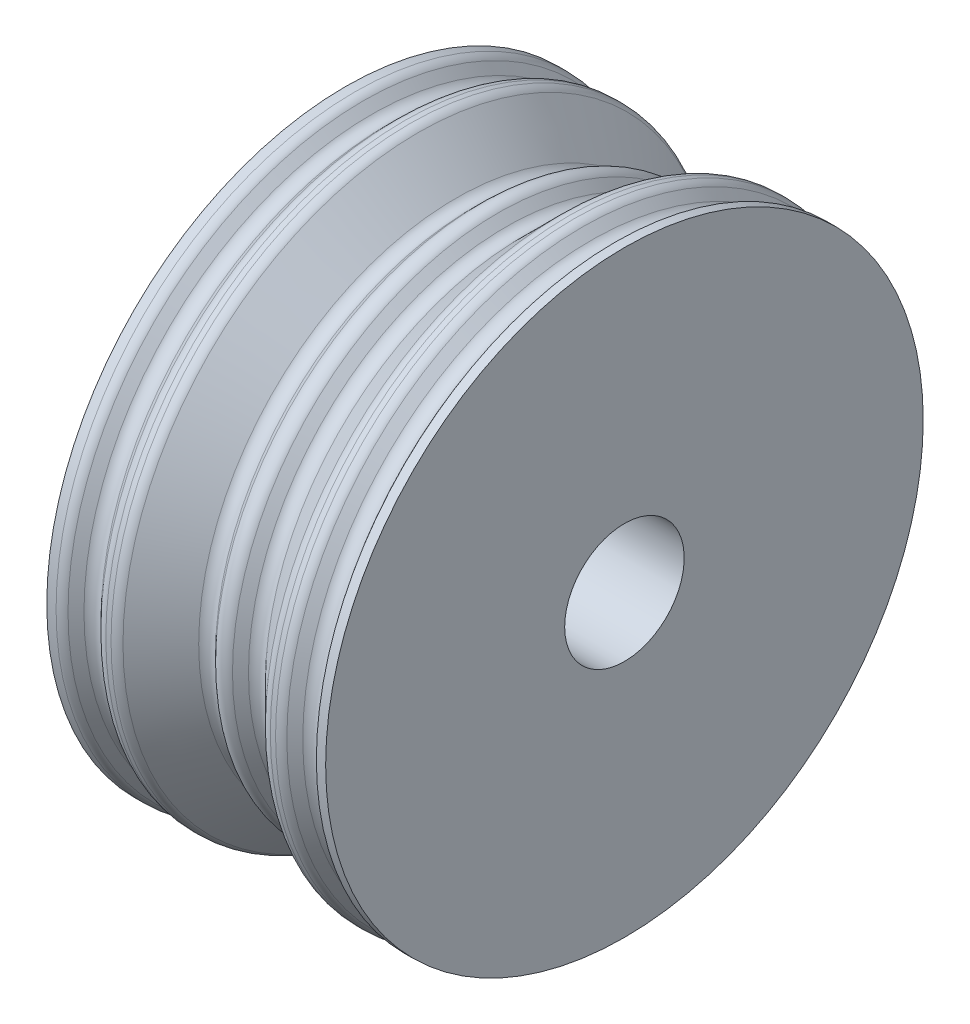
ISO-10303-21;
HEADER;
FILE_DESCRIPTION(('STEP AP214'),'2;1');
FILE_NAME('part.step','',(''),(''),'','','');
FILE_SCHEMA(('AUTOMOTIVE_DESIGN { 1 0 10303 214 1 1 1 1 }'));
ENDSEC;
DATA;
#1=APPLICATION_CONTEXT('core data for automotive mechanical design processes');
#2=APPLICATION_PROTOCOL_DEFINITION('international standard','automotive_design',2000,#1);
#3=PRODUCT_CONTEXT('',#1,'mechanical');
#4=PRODUCT('Part','Part','',(#3));
#5=PRODUCT_RELATED_PRODUCT_CATEGORY('part','',(#4));
#6=PRODUCT_DEFINITION_FORMATION('','',#4);
#7=PRODUCT_DEFINITION_CONTEXT('part definition',#1,'design');
#8=PRODUCT_DEFINITION('design','',#6,#7);
#9=PRODUCT_DEFINITION_SHAPE('','',#8);
#10=(LENGTH_UNIT() NAMED_UNIT(*) SI_UNIT(.MILLI.,.METRE.));
#11=(NAMED_UNIT(*) PLANE_ANGLE_UNIT() SI_UNIT($,.RADIAN.));
#12=(NAMED_UNIT(*) SI_UNIT($,.STERADIAN.) SOLID_ANGLE_UNIT());
#13=UNCERTAINTY_MEASURE_WITH_UNIT(LENGTH_MEASURE(1.E-05),#10,'distance_accuracy_value','');
#14=(GEOMETRIC_REPRESENTATION_CONTEXT(3) GLOBAL_UNCERTAINTY_ASSIGNED_CONTEXT((#13)) GLOBAL_UNIT_ASSIGNED_CONTEXT((#10,
#11,#12)) REPRESENTATION_CONTEXT('',''));
#15=CARTESIAN_POINT('',(0.,0.,0.));
#16=DIRECTION('',(0.,0.,1.));
#17=DIRECTION('',(1.,0.,0.));
#18=AXIS2_PLACEMENT_3D('',#15,#16,#17);
#19=CARTESIAN_POINT('',(0.,0.,0.));
#20=DIRECTION('',(-1.,0.,0.));
#21=DIRECTION('',(0.,0.,1.));
#22=AXIS2_PLACEMENT_3D('',#19,#20,#21);
#23=CYLINDRICAL_SURFACE('',#22,3.81);
#24=CARTESIAN_POINT('',(17.78,0.,0.));
#25=DIRECTION('',(-1.,0.,0.));
#26=DIRECTION('',(0.,0.,1.));
#27=AXIS2_PLACEMENT_3D('',#24,#25,#26);
#28=CIRCLE('',#27,3.81);
#29=CARTESIAN_POINT('',(17.78,0.,3.81));
#30=VERTEX_POINT('',#29);
#31=EDGE_CURVE('E113',#30,#30,#28,.T.);
#32=ORIENTED_EDGE('',*,*,#31,.F.);
#33=EDGE_LOOP('',(#32));
#34=FACE_BOUND('',#33,.T.);
#35=CARTESIAN_POINT('',(0.,0.,0.));
#36=DIRECTION('',(-1.,0.,0.));
#37=DIRECTION('',(0.,0.,1.));
#38=AXIS2_PLACEMENT_3D('',#35,#36,#37);
#39=CIRCLE('',#38,3.81);
#40=CARTESIAN_POINT('',(0.,0.,3.81));
#41=VERTEX_POINT('',#40);
#42=EDGE_CURVE('E10',#41,#41,#39,.T.);
#43=ORIENTED_EDGE('',*,*,#42,.T.);
#44=EDGE_LOOP('',(#43));
#45=FACE_BOUND('',#44,.T.);
#46=ADVANCED_FACE('F34',(#34,#45),#23,.F.);
#47=CARTESIAN_POINT('',(0.,3.81,0.));
#48=DIRECTION('',(1.,0.,0.));
#49=DIRECTION('',(0.,0.,-1.));
#50=AXIS2_PLACEMENT_3D('',#47,#48,#49);
#51=PLANE('',#50);
#52=ORIENTED_EDGE('',*,*,#42,.F.);
#53=EDGE_LOOP('',(#52));
#54=FACE_BOUND('',#53,.T.);
#55=CARTESIAN_POINT('',(0.,0.,0.));
#56=DIRECTION('',(-1.,0.,0.));
#57=DIRECTION('',(0.,0.,1.));
#58=AXIS2_PLACEMENT_3D('',#55,#56,#57);
#59=CIRCLE('',#58,19.05);
#60=CARTESIAN_POINT('',(0.,0.,19.05));
#61=VERTEX_POINT('',#60);
#62=EDGE_CURVE('E40',#61,#61,#59,.T.);
#63=ORIENTED_EDGE('',*,*,#62,.T.);
#64=EDGE_LOOP('',(#63));
#65=FACE_BOUND('',#64,.T.);
#66=ADVANCED_FACE('F120',(#54,#65),#51,.F.);
#67=CARTESIAN_POINT('',(0.,0.,0.));
#68=DIRECTION('',(-1.,0.,0.));
#69=DIRECTION('',(0.,0.,1.));
#70=AXIS2_PLACEMENT_3D('',#67,#68,#69);
#71=CYLINDRICAL_SURFACE('',#70,19.05);
#72=ORIENTED_EDGE('',*,*,#62,.F.);
#73=EDGE_LOOP('',(#72));
#74=FACE_BOUND('',#73,.T.);
#75=CARTESIAN_POINT('',(0.592615410136556,0.,0.));
#76=DIRECTION('',(-1.,0.,0.));
#77=DIRECTION('',(0.,0.,1.));
#78=AXIS2_PLACEMENT_3D('',#75,#76,#77);
#79=CIRCLE('',#78,19.05);
#80=CARTESIAN_POINT('',(0.592615410136556,0.,19.05));
#81=VERTEX_POINT('',#80);
#82=EDGE_CURVE('E44',#81,#81,#79,.T.);
#83=ORIENTED_EDGE('',*,*,#82,.T.);
#84=EDGE_LOOP('',(#83));
#85=FACE_BOUND('',#84,.T.);
#86=ADVANCED_FACE('F124',(#74,#85),#71,.T.);
#87=CARTESIAN_POINT('',(0.592615410136556,0.,0.));
#88=DIRECTION('',(-1.,0.,0.));
#89=DIRECTION('',(0.,0.,1.));
#90=AXIS2_PLACEMENT_3D('',#87,#88,#89);
#91=TOROIDAL_SURFACE('',#90,18.288,0.761999999999999);
#92=ORIENTED_EDGE('',*,*,#82,.F.);
#93=EDGE_LOOP('',(#92));
#94=FACE_BOUND('',#93,.T.);
#95=CARTESIAN_POINT('',(1.13143077740071,0.,0.));
#96=DIRECTION('',(-1.,0.,0.));
#97=DIRECTION('',(0.,0.,1.));
#98=AXIS2_PLACEMENT_3D('',#95,#96,#97);
#99=CIRCLE('',#98,18.8268153672641);
#100=CARTESIAN_POINT('',(1.13143077740071,0.,18.8268153672641));
#101=VERTEX_POINT('',#100);
#102=EDGE_CURVE('E48',#101,#101,#99,.T.);
#103=ORIENTED_EDGE('',*,*,#102,.T.);
#104=EDGE_LOOP('',(#103));
#105=FACE_BOUND('',#104,.T.);
#106=ADVANCED_FACE('F129',(#94,#105),#91,.T.);
#107=CARTESIAN_POINT('',(1.63943077740059,0.,0.));
#108=DIRECTION('',(-1.,0.,0.));
#109=DIRECTION('',(0.,0.,1.));
#110=AXIS2_PLACEMENT_3D('',#107,#108,#109);
#111=CONICAL_SURFACE('',#110,18.3188153672643,0.78539816339745);
#112=ORIENTED_EDGE('',*,*,#102,.F.);
#113=EDGE_LOOP('',(#112));
#114=FACE_BOUND('',#113,.T.);
#115=CARTESIAN_POINT('',(1.63943077740059,0.,0.));
#116=DIRECTION('',(-1.,0.,0.));
#117=DIRECTION('',(0.,0.,1.));
#118=AXIS2_PLACEMENT_3D('',#115,#116,#117);
#119=CIRCLE('',#118,18.3188153672643);
#120=CARTESIAN_POINT('',(1.63943077740059,0.,18.3188153672643));
#121=VERTEX_POINT('',#120);
#122=EDGE_CURVE('E53',#121,#121,#119,.T.);
#123=ORIENTED_EDGE('',*,*,#122,.T.);
#124=EDGE_LOOP('',(#123));
#125=FACE_BOUND('',#124,.T.);
#126=ADVANCED_FACE('F135',(#114,#125),#111,.T.);
#127=CARTESIAN_POINT('',(2.17824614466475,0.,0.));
#128=DIRECTION('',(-1.,0.,0.));
#129=DIRECTION('',(0.,0.,1.));
#130=AXIS2_PLACEMENT_3D('',#127,#128,#129);
#131=TOROIDAL_SURFACE('',#130,18.8576307345284,0.762);
#132=ORIENTED_EDGE('',*,*,#122,.F.);
#133=EDGE_LOOP('',(#132));
#134=FACE_BOUND('',#133,.T.);
#135=CARTESIAN_POINT('',(2.7170615119289,0.,0.));
#136=DIRECTION('',(-1.,0.,0.));
#137=DIRECTION('',(0.,0.,1.));
#138=AXIS2_PLACEMENT_3D('',#135,#136,#137);
#139=CIRCLE('',#138,18.3188153672643);
#140=CARTESIAN_POINT('',(2.7170615119289,0.,18.3188153672643));
#141=VERTEX_POINT('',#140);
#142=EDGE_CURVE('E56',#141,#141,#139,.T.);
#143=ORIENTED_EDGE('',*,*,#142,.T.);
#144=EDGE_LOOP('',(#143));
#145=FACE_BOUND('',#144,.T.);
#146=ADVANCED_FACE('F139',(#134,#145),#131,.F.);
#147=CARTESIAN_POINT('',(3.22506151192878,0.,0.));
#148=DIRECTION('',(1.,0.,0.));
#149=DIRECTION('',(0.,0.,-1.));
#150=AXIS2_PLACEMENT_3D('',#147,#148,#149);
#151=CONICAL_SURFACE('',#150,18.8268153672641,0.785398163397451);
#152=ORIENTED_EDGE('',*,*,#142,.F.);
#153=EDGE_LOOP('',(#152));
#154=FACE_BOUND('',#153,.T.);
#155=CARTESIAN_POINT('',(3.22506151192878,0.,0.));
#156=DIRECTION('',(-1.,0.,0.));
#157=DIRECTION('',(0.,0.,1.));
#158=AXIS2_PLACEMENT_3D('',#155,#156,#157);
#159=CIRCLE('',#158,18.8268153672641);
#160=CARTESIAN_POINT('',(3.22506151192878,0.,18.8268153672641));
#161=VERTEX_POINT('',#160);
#162=EDGE_CURVE('E59',#161,#161,#159,.T.);
#163=ORIENTED_EDGE('',*,*,#162,.T.);
#164=EDGE_LOOP('',(#163));
#165=FACE_BOUND('',#164,.T.);
#166=ADVANCED_FACE('F143',(#154,#165),#151,.T.);
#167=CARTESIAN_POINT('',(3.76387687919293,0.,0.));
#168=DIRECTION('',(-1.,0.,0.));
#169=DIRECTION('',(0.,0.,1.));
#170=AXIS2_PLACEMENT_3D('',#167,#168,#169);
#171=TOROIDAL_SURFACE('',#170,18.288,0.761999999999999);
#172=ORIENTED_EDGE('',*,*,#162,.F.);
#173=EDGE_LOOP('',(#172));
#174=FACE_BOUND('',#173,.T.);
#175=CARTESIAN_POINT('',(3.76387687919293,0.,0.));
#176=DIRECTION('',(-1.,0.,0.));
#177=DIRECTION('',(0.,0.,1.));
#178=AXIS2_PLACEMENT_3D('',#175,#176,#177);
#179=CIRCLE('',#178,19.05);
#180=CARTESIAN_POINT('',(3.76387687919293,0.,19.05));
#181=VERTEX_POINT('',#180);
#182=EDGE_CURVE('E62',#181,#181,#179,.T.);
#183=ORIENTED_EDGE('',*,*,#182,.T.);
#184=EDGE_LOOP('',(#183));
#185=FACE_BOUND('',#184,.T.);
#186=ADVANCED_FACE('F147',(#174,#185),#171,.T.);
#187=CARTESIAN_POINT('',(0.,0.,0.));
#188=DIRECTION('',(-1.,0.,0.));
#189=DIRECTION('',(0.,0.,1.));
#190=AXIS2_PLACEMENT_3D('',#187,#188,#189);
#191=CYLINDRICAL_SURFACE('',#190,19.05);
#192=ORIENTED_EDGE('',*,*,#182,.F.);
#193=EDGE_LOOP('',(#192));
#194=FACE_BOUND('',#193,.T.);
#195=CARTESIAN_POINT('',(4.09697185588376,0.,0.));
#196=DIRECTION('',(-1.,0.,0.));
#197=DIRECTION('',(0.,0.,1.));
#198=AXIS2_PLACEMENT_3D('',#195,#196,#197);
#199=CIRCLE('',#198,19.05);
#200=CARTESIAN_POINT('',(4.09697185588376,0.,19.05));
#201=VERTEX_POINT('',#200);
#202=EDGE_CURVE('E65',#201,#201,#199,.T.);
#203=ORIENTED_EDGE('',*,*,#202,.T.);
#204=EDGE_LOOP('',(#203));
#205=FACE_BOUND('',#204,.T.);
#206=ADVANCED_FACE('F151',(#194,#205),#191,.T.);
#207=CARTESIAN_POINT('',(4.09697185588376,0.,0.));
#208=DIRECTION('',(-1.,0.,0.));
#209=DIRECTION('',(0.,0.,1.));
#210=AXIS2_PLACEMENT_3D('',#207,#208,#209);
#211=TOROIDAL_SURFACE('',#210,18.288,0.762);
#212=ORIENTED_EDGE('',*,*,#202,.F.);
#213=EDGE_LOOP('',(#212));
#214=FACE_BOUND('',#213,.T.);
#215=CARTESIAN_POINT('',(4.63578722314792,0.,0.));
#216=DIRECTION('',(-1.,0.,0.));
#217=DIRECTION('',(0.,0.,1.));
#218=AXIS2_PLACEMENT_3D('',#215,#216,#217);
#219=CIRCLE('',#218,18.8268153672641);
#220=CARTESIAN_POINT('',(4.63578722314792,0.,18.8268153672641));
#221=VERTEX_POINT('',#220);
#222=EDGE_CURVE('E68',#221,#221,#219,.T.);
#223=ORIENTED_EDGE('',*,*,#222,.T.);
#224=EDGE_LOOP('',(#223));
#225=FACE_BOUND('',#224,.T.);
#226=ADVANCED_FACE('F155',(#214,#225),#211,.T.);
#227=CARTESIAN_POINT('',(7.04878722314781,0.,0.));
#228=DIRECTION('',(-1.,0.,0.));
#229=DIRECTION('',(0.,0.,1.));
#230=AXIS2_PLACEMENT_3D('',#227,#228,#229);
#231=CONICAL_SURFACE('',#230,16.4138153672642,0.785398163397466);
#232=ORIENTED_EDGE('',*,*,#222,.F.);
#233=EDGE_LOOP('',(#232));
#234=FACE_BOUND('',#233,.T.);
#235=CARTESIAN_POINT('',(7.04878722314781,0.,0.));
#236=DIRECTION('',(-1.,0.,0.));
#237=DIRECTION('',(0.,0.,1.));
#238=AXIS2_PLACEMENT_3D('',#235,#236,#237);
#239=CIRCLE('',#238,16.4138153672642);
#240=CARTESIAN_POINT('',(7.04878722314781,0.,16.4138153672642));
#241=VERTEX_POINT('',#240);
#242=EDGE_CURVE('E71',#241,#241,#239,.T.);
#243=ORIENTED_EDGE('',*,*,#242,.T.);
#244=EDGE_LOOP('',(#243));
#245=FACE_BOUND('',#244,.T.);
#246=ADVANCED_FACE('F159',(#234,#245),#231,.T.);
#247=CARTESIAN_POINT('',(7.58760259041197,0.,0.));
#248=DIRECTION('',(-1.,0.,0.));
#249=DIRECTION('',(0.,0.,1.));
#250=AXIS2_PLACEMENT_3D('',#247,#248,#249);
#251=TOROIDAL_SURFACE('',#250,16.9526307345283,0.761999999999999);
#252=ORIENTED_EDGE('',*,*,#242,.F.);
#253=EDGE_LOOP('',(#252));
#254=FACE_BOUND('',#253,.T.);
#255=CARTESIAN_POINT('',(8.12641795767611,0.,0.));
#256=DIRECTION('',(-1.,0.,0.));
#257=DIRECTION('',(0.,0.,1.));
#258=AXIS2_PLACEMENT_3D('',#255,#256,#257);
#259=CIRCLE('',#258,16.4138153672641);
#260=CARTESIAN_POINT('',(8.12641795767611,0.,16.4138153672641));
#261=VERTEX_POINT('',#260);
#262=EDGE_CURVE('E74',#261,#261,#259,.T.);
#263=ORIENTED_EDGE('',*,*,#262,.T.);
#264=EDGE_LOOP('',(#263));
#265=FACE_BOUND('',#264,.T.);
#266=ADVANCED_FACE('F163',(#254,#265),#251,.F.);
#267=CARTESIAN_POINT('',(8.63628722314785,0.,0.));
#268=DIRECTION('',(1.,0.,0.));
#269=DIRECTION('',(0.,0.,-1.));
#270=AXIS2_PLACEMENT_3D('',#267,#268,#269);
#271=CONICAL_SURFACE('',#270,16.9236846327359,0.785398163397425);
#272=ORIENTED_EDGE('',*,*,#262,.F.);
#273=EDGE_LOOP('',(#272));
#274=FACE_BOUND('',#273,.T.);
#275=CARTESIAN_POINT('',(8.63628722314785,0.,0.));
#276=DIRECTION('',(-1.,0.,0.));
#277=DIRECTION('',(0.,0.,1.));
#278=AXIS2_PLACEMENT_3D('',#275,#276,#277);
#279=CIRCLE('',#278,16.9236846327359);
#280=CARTESIAN_POINT('',(8.63628722314785,0.,16.9236846327359));
#281=VERTEX_POINT('',#280);
#282=EDGE_CURVE('E77',#281,#281,#279,.T.);
#283=ORIENTED_EDGE('',*,*,#282,.T.);
#284=EDGE_LOOP('',(#283));
#285=FACE_BOUND('',#284,.T.);
#286=ADVANCED_FACE('F167',(#274,#285),#271,.T.);
#287=CARTESIAN_POINT('',(9.17510259041199,0.,0.));
#288=DIRECTION('',(-1.,0.,0.));
#289=DIRECTION('',(0.,0.,1.));
#290=AXIS2_PLACEMENT_3D('',#287,#288,#289);
#291=TOROIDAL_SURFACE('',#290,16.3848692654717,0.762);
#292=ORIENTED_EDGE('',*,*,#282,.F.);
#293=EDGE_LOOP('',(#292));
#294=FACE_BOUND('',#293,.T.);
#295=CARTESIAN_POINT('',(9.71391795767614,0.,0.));
#296=DIRECTION('',(-1.,0.,0.));
#297=DIRECTION('',(0.,0.,1.));
#298=AXIS2_PLACEMENT_3D('',#295,#296,#297);
#299=CIRCLE('',#298,16.9236846327358);
#300=CARTESIAN_POINT('',(9.71391795767614,0.,16.9236846327358));
#301=VERTEX_POINT('',#300);
#302=EDGE_CURVE('E80',#301,#301,#299,.T.);
#303=ORIENTED_EDGE('',*,*,#302,.T.);
#304=EDGE_LOOP('',(#303));
#305=FACE_BOUND('',#304,.T.);
#306=ADVANCED_FACE('F171',(#294,#305),#291,.T.);
#307=CARTESIAN_POINT('',(10.2237872231478,0.,0.));
#308=DIRECTION('',(-1.,0.,0.));
#309=DIRECTION('',(0.,0.,1.));
#310=AXIS2_PLACEMENT_3D('',#307,#308,#309);
#311=CONICAL_SURFACE('',#310,16.4138153672642,0.78539816339747);
#312=ORIENTED_EDGE('',*,*,#302,.F.);
#313=EDGE_LOOP('',(#312));
#314=FACE_BOUND('',#313,.T.);
#315=CARTESIAN_POINT('',(10.2237872231478,0.,0.));
#316=DIRECTION('',(-1.,0.,0.));
#317=DIRECTION('',(0.,0.,1.));
#318=AXIS2_PLACEMENT_3D('',#315,#316,#317);
#319=CIRCLE('',#318,16.4138153672642);
#320=CARTESIAN_POINT('',(10.2237872231478,0.,16.4138153672642));
#321=VERTEX_POINT('',#320);
#322=EDGE_CURVE('E83',#321,#321,#319,.T.);
#323=ORIENTED_EDGE('',*,*,#322,.T.);
#324=EDGE_LOOP('',(#323));
#325=FACE_BOUND('',#324,.T.);
#326=ADVANCED_FACE('F175',(#314,#325),#311,.T.);
#327=CARTESIAN_POINT('',(10.762602590412,0.,0.));
#328=DIRECTION('',(-1.,0.,0.));
#329=DIRECTION('',(0.,0.,1.));
#330=AXIS2_PLACEMENT_3D('',#327,#328,#329);
#331=TOROIDAL_SURFACE('',#330,16.9526307345283,0.762000000000003);
#332=ORIENTED_EDGE('',*,*,#322,.F.);
#333=EDGE_LOOP('',(#332));
#334=FACE_BOUND('',#333,.T.);
#335=CARTESIAN_POINT('',(11.3014179576761,0.,0.));
#336=DIRECTION('',(-1.,0.,0.));
#337=DIRECTION('',(0.,0.,1.));
#338=AXIS2_PLACEMENT_3D('',#335,#336,#337);
#339=CIRCLE('',#338,16.4138153672642);
#340=CARTESIAN_POINT('',(11.3014179576761,0.,16.4138153672642));
#341=VERTEX_POINT('',#340);
#342=EDGE_CURVE('E86',#341,#341,#339,.T.);
#343=ORIENTED_EDGE('',*,*,#342,.T.);
#344=EDGE_LOOP('',(#343));
#345=FACE_BOUND('',#344,.T.);
#346=ADVANCED_FACE('F179',(#334,#345),#331,.F.);
#347=CARTESIAN_POINT('',(13.714417957676,0.,0.));
#348=DIRECTION('',(1.,0.,0.));
#349=DIRECTION('',(0.,0.,-1.));
#350=AXIS2_PLACEMENT_3D('',#347,#348,#349);
#351=CONICAL_SURFACE('',#350,18.8268153672641,0.785398163397462);
#352=ORIENTED_EDGE('',*,*,#342,.F.);
#353=EDGE_LOOP('',(#352));
#354=FACE_BOUND('',#353,.T.);
#355=CARTESIAN_POINT('',(13.714417957676,0.,0.));
#356=DIRECTION('',(-1.,0.,0.));
#357=DIRECTION('',(0.,0.,1.));
#358=AXIS2_PLACEMENT_3D('',#355,#356,#357);
#359=CIRCLE('',#358,18.8268153672641);
#360=CARTESIAN_POINT('',(13.714417957676,0.,18.8268153672641));
#361=VERTEX_POINT('',#360);
#362=EDGE_CURVE('E89',#361,#361,#359,.T.);
#363=ORIENTED_EDGE('',*,*,#362,.T.);
#364=EDGE_LOOP('',(#363));
#365=FACE_BOUND('',#364,.T.);
#366=ADVANCED_FACE('F183',(#354,#365),#351,.T.);
#367=CARTESIAN_POINT('',(14.2532333249402,0.,0.));
#368=DIRECTION('',(-1.,0.,0.));
#369=DIRECTION('',(0.,0.,1.));
#370=AXIS2_PLACEMENT_3D('',#367,#368,#369);
#371=TOROIDAL_SURFACE('',#370,18.288,0.761999999999997);
#372=ORIENTED_EDGE('',*,*,#362,.F.);
#373=EDGE_LOOP('',(#372));
#374=FACE_BOUND('',#373,.T.);
#375=CARTESIAN_POINT('',(14.2532333249402,0.,0.));
#376=DIRECTION('',(-1.,0.,0.));
#377=DIRECTION('',(0.,0.,1.));
#378=AXIS2_PLACEMENT_3D('',#375,#376,#377);
#379=CIRCLE('',#378,19.05);
#380=CARTESIAN_POINT('',(14.2532333249402,0.,19.05));
#381=VERTEX_POINT('',#380);
#382=EDGE_CURVE('E92',#381,#381,#379,.T.);
#383=ORIENTED_EDGE('',*,*,#382,.T.);
#384=EDGE_LOOP('',(#383));
#385=FACE_BOUND('',#384,.T.);
#386=ADVANCED_FACE('F187',(#374,#385),#371,.T.);
#387=CARTESIAN_POINT('',(0.,0.,0.));
#388=DIRECTION('',(-1.,0.,0.));
#389=DIRECTION('',(0.,0.,1.));
#390=AXIS2_PLACEMENT_3D('',#387,#388,#389);
#391=CYLINDRICAL_SURFACE('',#390,19.05);
#392=ORIENTED_EDGE('',*,*,#382,.F.);
#393=EDGE_LOOP('',(#392));
#394=FACE_BOUND('',#393,.T.);
#395=CARTESIAN_POINT('',(14.586328301631,0.,0.));
#396=DIRECTION('',(-1.,0.,0.));
#397=DIRECTION('',(0.,0.,1.));
#398=AXIS2_PLACEMENT_3D('',#395,#396,#397);
#399=CIRCLE('',#398,19.05);
#400=CARTESIAN_POINT('',(14.586328301631,0.,19.05));
#401=VERTEX_POINT('',#400);
#402=EDGE_CURVE('E95',#401,#401,#399,.T.);
#403=ORIENTED_EDGE('',*,*,#402,.T.);
#404=EDGE_LOOP('',(#403));
#405=FACE_BOUND('',#404,.T.);
#406=ADVANCED_FACE('F191',(#394,#405),#391,.T.);
#407=CARTESIAN_POINT('',(14.586328301631,0.,0.));
#408=DIRECTION('',(-1.,0.,0.));
#409=DIRECTION('',(0.,0.,1.));
#410=AXIS2_PLACEMENT_3D('',#407,#408,#409);
#411=TOROIDAL_SURFACE('',#410,18.288,0.761999999999999);
#412=ORIENTED_EDGE('',*,*,#402,.F.);
#413=EDGE_LOOP('',(#412));
#414=FACE_BOUND('',#413,.T.);
#415=CARTESIAN_POINT('',(15.1034620967419,0.,0.));
#416=DIRECTION('',(-1.,0.,0.));
#417=DIRECTION('',(0.,0.,1.));
#418=AXIS2_PLACEMENT_3D('',#415,#416,#417);
#419=CIRCLE('',#418,18.8476576077873);
#420=CARTESIAN_POINT('',(15.1034620967419,0.,18.8476576077873));
#421=VERTEX_POINT('',#420);
#422=EDGE_CURVE('E98',#421,#421,#419,.T.);
#423=ORIENTED_EDGE('',*,*,#422,.T.);
#424=EDGE_LOOP('',(#423));
#425=FACE_BOUND('',#424,.T.);
#426=ADVANCED_FACE('F195',(#414,#425),#411,.T.);
#427=CARTESIAN_POINT('',(15.6311123495538,0.,0.));
#428=DIRECTION('',(-1.,0.,0.));
#429=DIRECTION('',(0.,0.,1.));
#430=AXIS2_PLACEMENT_3D('',#427,#428,#429);
#431=CONICAL_SURFACE('',#430,18.3600991900492,0.745927447786145);
#432=ORIENTED_EDGE('',*,*,#422,.F.);
#433=EDGE_LOOP('',(#432));
#434=FACE_BOUND('',#433,.T.);
#435=CARTESIAN_POINT('',(15.6311123495538,0.,0.));
#436=DIRECTION('',(-1.,0.,0.));
#437=DIRECTION('',(0.,0.,1.));
#438=AXIS2_PLACEMENT_3D('',#435,#436,#437);
#439=CIRCLE('',#438,18.3600991900492);
#440=CARTESIAN_POINT('',(15.6311123495538,0.,18.3600991900492));
#441=VERTEX_POINT('',#440);
#442=EDGE_CURVE('E101',#441,#441,#439,.T.);
#443=ORIENTED_EDGE('',*,*,#442,.T.);
#444=EDGE_LOOP('',(#443));
#445=FACE_BOUND('',#444,.T.);
#446=ADVANCED_FACE('F199',(#434,#445),#431,.T.);
#447=CARTESIAN_POINT('',(16.1482461446647,0.,0.));
#448=DIRECTION('',(-1.,0.,0.));
#449=DIRECTION('',(0.,0.,1.));
#450=AXIS2_PLACEMENT_3D('',#447,#448,#449);
#451=TOROIDAL_SURFACE('',#450,18.9197567978365,0.761999999999999);
#452=ORIENTED_EDGE('',*,*,#442,.F.);
#453=EDGE_LOOP('',(#452));
#454=FACE_BOUND('',#453,.T.);
#455=CARTESIAN_POINT('',(16.7633870990312,0.,0.));
#456=DIRECTION('',(-1.,0.,0.));
#457=DIRECTION('',(0.,0.,1.));
#458=AXIS2_PLACEMENT_3D('',#455,#456,#457);
#459=CIRCLE('',#458,18.470039546376);
#460=CARTESIAN_POINT('',(16.7633870990312,0.,18.470039546376));
#461=VERTEX_POINT('',#460);
#462=EDGE_CURVE('E104',#461,#461,#459,.T.);
#463=ORIENTED_EDGE('',*,*,#462,.T.);
#464=EDGE_LOOP('',(#463));
#465=FACE_BOUND('',#464,.T.);
#466=ADVANCED_FACE('F203',(#454,#465),#451,.F.);
#467=CARTESIAN_POINT('',(17.1873845898634,0.,0.));
#468=DIRECTION('',(1.,0.,0.));
#469=DIRECTION('',(0.,0.,-1.));
#470=AXIS2_PLACEMENT_3D('',#467,#468,#469);
#471=CONICAL_SURFACE('',#470,19.05,0.93951438224172);
#472=ORIENTED_EDGE('',*,*,#462,.F.);
#473=EDGE_LOOP('',(#472));
#474=FACE_BOUND('',#473,.T.);
#475=CARTESIAN_POINT('',(17.1873845898634,0.,0.));
#476=DIRECTION('',(-1.,0.,0.));
#477=DIRECTION('',(0.,0.,1.));
#478=AXIS2_PLACEMENT_3D('',#475,#476,#477);
#479=CIRCLE('',#478,19.05);
#480=CARTESIAN_POINT('',(17.1873845898634,0.,19.05));
#481=VERTEX_POINT('',#480);
#482=EDGE_CURVE('E107',#481,#481,#479,.T.);
#483=ORIENTED_EDGE('',*,*,#482,.T.);
#484=EDGE_LOOP('',(#483));
#485=FACE_BOUND('',#484,.T.);
#486=ADVANCED_FACE('F207',(#474,#485),#471,.T.);
#487=CARTESIAN_POINT('',(0.,0.,0.));
#488=DIRECTION('',(-1.,0.,0.));
#489=DIRECTION('',(0.,0.,1.));
#490=AXIS2_PLACEMENT_3D('',#487,#488,#489);
#491=CYLINDRICAL_SURFACE('',#490,19.05);
#492=ORIENTED_EDGE('',*,*,#482,.F.);
#493=EDGE_LOOP('',(#492));
#494=FACE_BOUND('',#493,.T.);
#495=CARTESIAN_POINT('',(17.78,0.,0.));
#496=DIRECTION('',(-1.,0.,0.));
#497=DIRECTION('',(0.,0.,1.));
#498=AXIS2_PLACEMENT_3D('',#495,#496,#497);
#499=CIRCLE('',#498,19.05);
#500=CARTESIAN_POINT('',(17.78,0.,19.05));
#501=VERTEX_POINT('',#500);
#502=EDGE_CURVE('E110',#501,#501,#499,.T.);
#503=ORIENTED_EDGE('',*,*,#502,.T.);
#504=EDGE_LOOP('',(#503));
#505=FACE_BOUND('',#504,.T.);
#506=ADVANCED_FACE('F211',(#494,#505),#491,.T.);
#507=CARTESIAN_POINT('',(17.78,19.05,0.));
#508=DIRECTION('',(-1.,0.,0.));
#509=DIRECTION('',(0.,0.,1.));
#510=AXIS2_PLACEMENT_3D('',#507,#508,#509);
#511=PLANE('',#510);
#512=ORIENTED_EDGE('',*,*,#502,.F.);
#513=EDGE_LOOP('',(#512));
#514=FACE_BOUND('',#513,.T.);
#515=ORIENTED_EDGE('',*,*,#31,.T.);
#516=EDGE_LOOP('',(#515));
#517=FACE_BOUND('',#516,.T.);
#518=ADVANCED_FACE('F117',(#514,#517),#511,.F.);
#519=CLOSED_SHELL('',(#46,#66,#86,#106,#126,#146,#166,#186,#206,#226,#246,#266,#286,#306,#326,
#346,#366,#386,#406,#426,#446,#466,#486,#506,#518));
#520=MANIFOLD_SOLID_BREP('B2',#519);
#521=ADVANCED_BREP_SHAPE_REPRESENTATION('',(#18,#520),#14);
#522=SHAPE_DEFINITION_REPRESENTATION(#9,#521);
ENDSEC;
END-ISO-10303-21;
